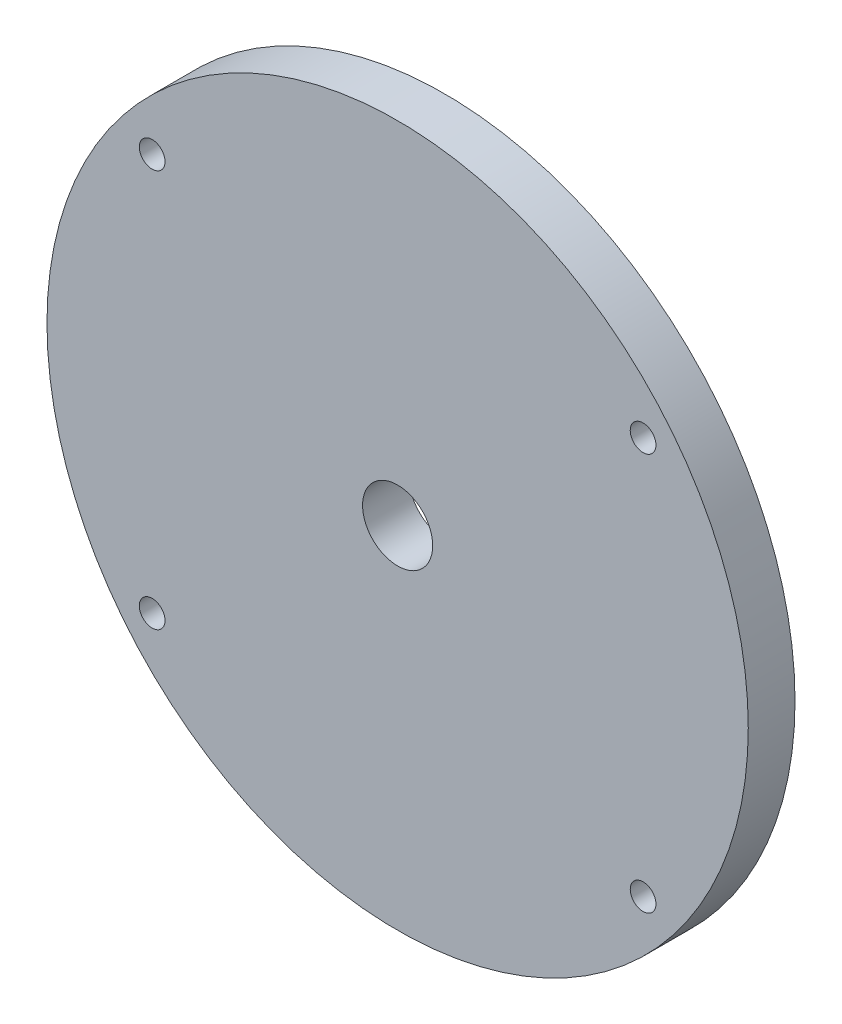
ISO-10303-21;
HEADER;
FILE_DESCRIPTION(('STEP AP214'),'2;1');
FILE_NAME('part.step','',(''),(''),'','','');
FILE_SCHEMA(('AUTOMOTIVE_DESIGN { 1 0 10303 214 1 1 1 1 }'));
ENDSEC;
DATA;
#1=APPLICATION_CONTEXT('core data for automotive mechanical design processes');
#2=APPLICATION_PROTOCOL_DEFINITION('international standard','automotive_design',2000,#1);
#3=PRODUCT_CONTEXT('',#1,'mechanical');
#4=PRODUCT('Part','Part','',(#3));
#5=PRODUCT_RELATED_PRODUCT_CATEGORY('part','',(#4));
#6=PRODUCT_DEFINITION_FORMATION('','',#4);
#7=PRODUCT_DEFINITION_CONTEXT('part definition',#1,'design');
#8=PRODUCT_DEFINITION('design','',#6,#7);
#9=PRODUCT_DEFINITION_SHAPE('','',#8);
#10=(LENGTH_UNIT() NAMED_UNIT(*) SI_UNIT(.MILLI.,.METRE.));
#11=(NAMED_UNIT(*) PLANE_ANGLE_UNIT() SI_UNIT($,.RADIAN.));
#12=(NAMED_UNIT(*) SI_UNIT($,.STERADIAN.) SOLID_ANGLE_UNIT());
#13=UNCERTAINTY_MEASURE_WITH_UNIT(LENGTH_MEASURE(1.E-05),#10,'distance_accuracy_value','');
#14=(GEOMETRIC_REPRESENTATION_CONTEXT(3) GLOBAL_UNCERTAINTY_ASSIGNED_CONTEXT((#13)) GLOBAL_UNIT_ASSIGNED_CONTEXT((#10,
#11,#12)) REPRESENTATION_CONTEXT('',''));
#15=CARTESIAN_POINT('',(0.,0.,0.));
#16=DIRECTION('',(0.,0.,1.));
#17=DIRECTION('',(1.,0.,0.));
#18=AXIS2_PLACEMENT_3D('',#15,#16,#17);
#19=CARTESIAN_POINT('',(0.,0.,0.));
#20=DIRECTION('',(0.,0.,1.));
#21=DIRECTION('',(1.,0.,0.));
#22=AXIS2_PLACEMENT_3D('',#19,#20,#21);
#23=PLANE('',#22);
#24=CARTESIAN_POINT('',(-52.5,-42.5,0.));
#25=DIRECTION('',(0.,0.,-1.));
#26=DIRECTION('',(-1.,0.,0.));
#27=AXIS2_PLACEMENT_3D('',#24,#25,#26);
#28=CIRCLE('',#27,5.2);
#29=CARTESIAN_POINT('',(-57.7,-42.5,0.));
#30=VERTEX_POINT('',#29);
#31=EDGE_CURVE('E94',#30,#30,#28,.T.);
#32=ORIENTED_EDGE('',*,*,#31,.F.);
#33=EDGE_LOOP('',(#32));
#34=FACE_BOUND('',#33,.T.);
#35=CARTESIAN_POINT('',(52.5,-42.5,0.));
#36=DIRECTION('',(0.,0.,-1.));
#37=DIRECTION('',(-1.,0.,0.));
#38=AXIS2_PLACEMENT_3D('',#35,#36,#37);
#39=CIRCLE('',#38,5.2);
#40=CARTESIAN_POINT('',(47.3,-42.5,0.));
#41=VERTEX_POINT('',#40);
#42=EDGE_CURVE('E85',#41,#41,#39,.T.);
#43=ORIENTED_EDGE('',*,*,#42,.F.);
#44=EDGE_LOOP('',(#43));
#45=FACE_BOUND('',#44,.T.);
#46=CARTESIAN_POINT('',(0.,0.,0.));
#47=DIRECTION('',(0.,0.,1.));
#48=DIRECTION('',(1.,0.,0.));
#49=AXIS2_PLACEMENT_3D('',#46,#47,#48);
#50=CIRCLE('',#49,7.5);
#51=CARTESIAN_POINT('',(7.5,0.,0.));
#52=VERTEX_POINT('',#51);
#53=EDGE_CURVE('E56',#52,#52,#50,.T.);
#54=ORIENTED_EDGE('',*,*,#53,.T.);
#55=EDGE_LOOP('',(#54));
#56=FACE_BOUND('',#55,.T.);
#57=CARTESIAN_POINT('',(0.,0.,0.));
#58=DIRECTION('',(0.,0.,1.));
#59=DIRECTION('',(1.,0.,0.));
#60=AXIS2_PLACEMENT_3D('',#57,#58,#59);
#61=CIRCLE('',#60,75.);
#62=CARTESIAN_POINT('',(75.,0.,0.));
#63=VERTEX_POINT('',#62);
#64=EDGE_CURVE('E47',#63,#63,#61,.T.);
#65=ORIENTED_EDGE('',*,*,#64,.F.);
#66=EDGE_LOOP('',(#65));
#67=FACE_BOUND('',#66,.T.);
#68=CARTESIAN_POINT('',(-52.5,42.5,0.));
#69=DIRECTION('',(0.,0.,-1.));
#70=DIRECTION('',(-1.,0.,0.));
#71=AXIS2_PLACEMENT_3D('',#68,#69,#70);
#72=CIRCLE('',#71,5.2);
#73=CARTESIAN_POINT('',(-57.7,42.5,0.));
#74=VERTEX_POINT('',#73);
#75=EDGE_CURVE('E67',#74,#74,#72,.T.);
#76=ORIENTED_EDGE('',*,*,#75,.F.);
#77=EDGE_LOOP('',(#76));
#78=FACE_BOUND('',#77,.T.);
#79=CARTESIAN_POINT('',(52.5,42.5,0.));
#80=DIRECTION('',(0.,0.,-1.));
#81=DIRECTION('',(-1.,0.,0.));
#82=AXIS2_PLACEMENT_3D('',#79,#80,#81);
#83=CIRCLE('',#82,5.2);
#84=CARTESIAN_POINT('',(47.3,42.5,0.));
#85=VERTEX_POINT('',#84);
#86=EDGE_CURVE('E76',#85,#85,#83,.T.);
#87=ORIENTED_EDGE('',*,*,#86,.F.);
#88=EDGE_LOOP('',(#87));
#89=FACE_BOUND('',#88,.T.);
#90=ADVANCED_FACE('F43',(#34,#45,#56,#67,#78,#89),#23,.F.);
#91=CARTESIAN_POINT('',(0.,0.,10.));
#92=DIRECTION('',(0.,0.,1.));
#93=DIRECTION('',(1.,0.,0.));
#94=AXIS2_PLACEMENT_3D('',#91,#92,#93);
#95=PLANE('',#94);
#96=CARTESIAN_POINT('',(-52.5,-42.5,10.));
#97=DIRECTION('',(0.,0.,-1.));
#98=DIRECTION('',(-1.,0.,0.));
#99=AXIS2_PLACEMENT_3D('',#96,#97,#98);
#100=CIRCLE('',#99,2.75);
#101=CARTESIAN_POINT('',(-55.25,-42.5,10.));
#102=VERTEX_POINT('',#101);
#103=EDGE_CURVE('E88',#102,#102,#100,.T.);
#104=ORIENTED_EDGE('',*,*,#103,.T.);
#105=EDGE_LOOP('',(#104));
#106=FACE_BOUND('',#105,.T.);
#107=CARTESIAN_POINT('',(52.5,-42.5,10.));
#108=DIRECTION('',(0.,0.,-1.));
#109=DIRECTION('',(-1.,0.,0.));
#110=AXIS2_PLACEMENT_3D('',#107,#108,#109);
#111=CIRCLE('',#110,2.75);
#112=CARTESIAN_POINT('',(49.75,-42.5,10.));
#113=VERTEX_POINT('',#112);
#114=EDGE_CURVE('E79',#113,#113,#111,.T.);
#115=ORIENTED_EDGE('',*,*,#114,.T.);
#116=EDGE_LOOP('',(#115));
#117=FACE_BOUND('',#116,.T.);
#118=CARTESIAN_POINT('',(52.5,42.5,10.));
#119=DIRECTION('',(0.,0.,-1.));
#120=DIRECTION('',(-1.,0.,0.));
#121=AXIS2_PLACEMENT_3D('',#118,#119,#120);
#122=CIRCLE('',#121,2.75);
#123=CARTESIAN_POINT('',(49.75,42.5,10.));
#124=VERTEX_POINT('',#123);
#125=EDGE_CURVE('E70',#124,#124,#122,.T.);
#126=ORIENTED_EDGE('',*,*,#125,.T.);
#127=EDGE_LOOP('',(#126));
#128=FACE_BOUND('',#127,.T.);
#129=CARTESIAN_POINT('',(-52.5,42.5,10.));
#130=DIRECTION('',(0.,0.,-1.));
#131=DIRECTION('',(-1.,0.,0.));
#132=AXIS2_PLACEMENT_3D('',#129,#130,#131);
#133=CIRCLE('',#132,2.75);
#134=CARTESIAN_POINT('',(-55.25,42.5,10.));
#135=VERTEX_POINT('',#134);
#136=EDGE_CURVE('E59',#135,#135,#133,.T.);
#137=ORIENTED_EDGE('',*,*,#136,.T.);
#138=EDGE_LOOP('',(#137));
#139=FACE_BOUND('',#138,.T.);
#140=CARTESIAN_POINT('',(0.,0.,10.));
#141=DIRECTION('',(0.,0.,1.));
#142=DIRECTION('',(1.,0.,0.));
#143=AXIS2_PLACEMENT_3D('',#140,#141,#142);
#144=CIRCLE('',#143,75.);
#145=CARTESIAN_POINT('',(75.,0.,10.));
#146=VERTEX_POINT('',#145);
#147=EDGE_CURVE('E10',#146,#146,#144,.T.);
#148=ORIENTED_EDGE('',*,*,#147,.T.);
#149=EDGE_LOOP('',(#148));
#150=FACE_BOUND('',#149,.T.);
#151=CARTESIAN_POINT('',(0.,0.,10.));
#152=DIRECTION('',(0.,0.,1.));
#153=DIRECTION('',(1.,0.,0.));
#154=AXIS2_PLACEMENT_3D('',#151,#152,#153);
#155=CIRCLE('',#154,7.5);
#156=CARTESIAN_POINT('',(7.5,0.,10.));
#157=VERTEX_POINT('',#156);
#158=EDGE_CURVE('E54',#157,#157,#155,.T.);
#159=ORIENTED_EDGE('',*,*,#158,.F.);
#160=EDGE_LOOP('',(#159));
#161=FACE_BOUND('',#160,.T.);
#162=ADVANCED_FACE('F102',(#106,#117,#128,#139,#150,#161),#95,.T.);
#163=CARTESIAN_POINT('',(0.,0.,10.));
#164=DIRECTION('',(0.,0.,-1.));
#165=DIRECTION('',(-1.,0.,0.));
#166=AXIS2_PLACEMENT_3D('',#163,#164,#165);
#167=CYLINDRICAL_SURFACE('',#166,75.);
#168=ORIENTED_EDGE('',*,*,#147,.F.);
#169=EDGE_LOOP('',(#168));
#170=FACE_BOUND('',#169,.T.);
#171=ORIENTED_EDGE('',*,*,#64,.T.);
#172=EDGE_LOOP('',(#171));
#173=FACE_BOUND('',#172,.T.);
#174=ADVANCED_FACE('F45',(#170,#173),#167,.T.);
#175=CARTESIAN_POINT('',(0.,0.,10.));
#176=DIRECTION('',(0.,0.,-1.));
#177=DIRECTION('',(-1.,0.,0.));
#178=AXIS2_PLACEMENT_3D('',#175,#176,#177);
#179=CYLINDRICAL_SURFACE('',#178,7.5);
#180=ORIENTED_EDGE('',*,*,#158,.T.);
#181=EDGE_LOOP('',(#180));
#182=FACE_BOUND('',#181,.T.);
#183=ORIENTED_EDGE('',*,*,#53,.F.);
#184=EDGE_LOOP('',(#183));
#185=FACE_BOUND('',#184,.T.);
#186=ADVANCED_FACE('F138',(#182,#185),#179,.F.);
#187=CARTESIAN_POINT('',(-52.5,42.5,0.));
#188=DIRECTION('',(0.,0.,-1.));
#189=DIRECTION('',(-1.,0.,0.));
#190=AXIS2_PLACEMENT_3D('',#187,#188,#189);
#191=CYLINDRICAL_SURFACE('',#190,2.74999999999999);
#192=ORIENTED_EDGE('',*,*,#136,.F.);
#193=EDGE_LOOP('',(#192));
#194=FACE_BOUND('',#193,.T.);
#195=CARTESIAN_POINT('',(-52.5,42.5,2.45000000000001));
#196=DIRECTION('',(0.,0.,-1.));
#197=DIRECTION('',(-1.,0.,0.));
#198=AXIS2_PLACEMENT_3D('',#195,#196,#197);
#199=CIRCLE('',#198,2.74999999999999);
#200=CARTESIAN_POINT('',(-55.25,42.5,2.45000000000001));
#201=VERTEX_POINT('',#200);
#202=EDGE_CURVE('E64',#201,#201,#199,.T.);
#203=ORIENTED_EDGE('',*,*,#202,.T.);
#204=EDGE_LOOP('',(#203));
#205=FACE_BOUND('',#204,.T.);
#206=ADVANCED_FACE('F134',(#194,#205),#191,.F.);
#207=CARTESIAN_POINT('',(-52.5,42.5,0.));
#208=DIRECTION('',(0.,0.,-1.));
#209=DIRECTION('',(-1.,0.,0.));
#210=AXIS2_PLACEMENT_3D('',#207,#208,#209);
#211=CONICAL_SURFACE('',#210,5.2,0.785398163397449);
#212=ORIENTED_EDGE('',*,*,#202,.F.);
#213=EDGE_LOOP('',(#212));
#214=FACE_BOUND('',#213,.T.);
#215=ORIENTED_EDGE('',*,*,#75,.T.);
#216=EDGE_LOOP('',(#215));
#217=FACE_BOUND('',#216,.T.);
#218=ADVANCED_FACE('F126',(#214,#217),#211,.F.);
#219=CARTESIAN_POINT('',(52.5,42.5,0.));
#220=DIRECTION('',(0.,0.,-1.));
#221=DIRECTION('',(-1.,0.,0.));
#222=AXIS2_PLACEMENT_3D('',#219,#220,#221);
#223=CYLINDRICAL_SURFACE('',#222,2.74999999999999);
#224=ORIENTED_EDGE('',*,*,#125,.F.);
#225=EDGE_LOOP('',(#224));
#226=FACE_BOUND('',#225,.T.);
#227=CARTESIAN_POINT('',(52.5,42.5,2.45000000000001));
#228=DIRECTION('',(0.,0.,-1.));
#229=DIRECTION('',(-1.,0.,0.));
#230=AXIS2_PLACEMENT_3D('',#227,#228,#229);
#231=CIRCLE('',#230,2.74999999999999);
#232=CARTESIAN_POINT('',(49.75,42.5,2.45000000000001));
#233=VERTEX_POINT('',#232);
#234=EDGE_CURVE('E73',#233,#233,#231,.T.);
#235=ORIENTED_EDGE('',*,*,#234,.T.);
#236=EDGE_LOOP('',(#235));
#237=FACE_BOUND('',#236,.T.);
#238=ADVANCED_FACE('F116',(#226,#237),#223,.F.);
#239=CARTESIAN_POINT('',(52.5,42.5,0.));
#240=DIRECTION('',(0.,0.,-1.));
#241=DIRECTION('',(-1.,0.,0.));
#242=AXIS2_PLACEMENT_3D('',#239,#240,#241);
#243=CONICAL_SURFACE('',#242,5.2,0.785398163397449);
#244=ORIENTED_EDGE('',*,*,#234,.F.);
#245=EDGE_LOOP('',(#244));
#246=FACE_BOUND('',#245,.T.);
#247=ORIENTED_EDGE('',*,*,#86,.T.);
#248=EDGE_LOOP('',(#247));
#249=FACE_BOUND('',#248,.T.);
#250=ADVANCED_FACE('F113',(#246,#249),#243,.F.);
#251=CARTESIAN_POINT('',(52.5,-42.5,0.));
#252=DIRECTION('',(0.,0.,-1.));
#253=DIRECTION('',(-1.,0.,0.));
#254=AXIS2_PLACEMENT_3D('',#251,#252,#253);
#255=CYLINDRICAL_SURFACE('',#254,2.74999999999999);
#256=ORIENTED_EDGE('',*,*,#114,.F.);
#257=EDGE_LOOP('',(#256));
#258=FACE_BOUND('',#257,.T.);
#259=CARTESIAN_POINT('',(52.5,-42.5,2.45000000000001));
#260=DIRECTION('',(0.,0.,-1.));
#261=DIRECTION('',(-1.,0.,0.));
#262=AXIS2_PLACEMENT_3D('',#259,#260,#261);
#263=CIRCLE('',#262,2.74999999999999);
#264=CARTESIAN_POINT('',(49.75,-42.5,2.45000000000001));
#265=VERTEX_POINT('',#264);
#266=EDGE_CURVE('E82',#265,#265,#263,.T.);
#267=ORIENTED_EDGE('',*,*,#266,.T.);
#268=EDGE_LOOP('',(#267));
#269=FACE_BOUND('',#268,.T.);
#270=ADVANCED_FACE('F115',(#258,#269),#255,.F.);
#271=CARTESIAN_POINT('',(52.5,-42.5,0.));
#272=DIRECTION('',(0.,0.,-1.));
#273=DIRECTION('',(-1.,0.,0.));
#274=AXIS2_PLACEMENT_3D('',#271,#272,#273);
#275=CONICAL_SURFACE('',#274,5.2,0.785398163397449);
#276=ORIENTED_EDGE('',*,*,#266,.F.);
#277=EDGE_LOOP('',(#276));
#278=FACE_BOUND('',#277,.T.);
#279=ORIENTED_EDGE('',*,*,#42,.T.);
#280=EDGE_LOOP('',(#279));
#281=FACE_BOUND('',#280,.T.);
#282=ADVANCED_FACE('F123',(#278,#281),#275,.F.);
#283=CARTESIAN_POINT('',(-52.5,-42.5,0.));
#284=DIRECTION('',(0.,0.,-1.));
#285=DIRECTION('',(-1.,0.,0.));
#286=AXIS2_PLACEMENT_3D('',#283,#284,#285);
#287=CYLINDRICAL_SURFACE('',#286,2.74999999999999);
#288=ORIENTED_EDGE('',*,*,#103,.F.);
#289=EDGE_LOOP('',(#288));
#290=FACE_BOUND('',#289,.T.);
#291=CARTESIAN_POINT('',(-52.5,-42.5,2.45000000000001));
#292=DIRECTION('',(0.,0.,-1.));
#293=DIRECTION('',(-1.,0.,0.));
#294=AXIS2_PLACEMENT_3D('',#291,#292,#293);
#295=CIRCLE('',#294,2.74999999999999);
#296=CARTESIAN_POINT('',(-55.25,-42.5,2.45000000000001));
#297=VERTEX_POINT('',#296);
#298=EDGE_CURVE('E91',#297,#297,#295,.T.);
#299=ORIENTED_EDGE('',*,*,#298,.T.);
#300=EDGE_LOOP('',(#299));
#301=FACE_BOUND('',#300,.T.);
#302=ADVANCED_FACE('F168',(#290,#301),#287,.F.);
#303=CARTESIAN_POINT('',(-52.5,-42.5,0.));
#304=DIRECTION('',(0.,0.,-1.));
#305=DIRECTION('',(-1.,0.,0.));
#306=AXIS2_PLACEMENT_3D('',#303,#304,#305);
#307=CONICAL_SURFACE('',#306,5.2,0.785398163397449);
#308=ORIENTED_EDGE('',*,*,#298,.F.);
#309=EDGE_LOOP('',(#308));
#310=FACE_BOUND('',#309,.T.);
#311=ORIENTED_EDGE('',*,*,#31,.T.);
#312=EDGE_LOOP('',(#311));
#313=FACE_BOUND('',#312,.T.);
#314=ADVANCED_FACE('F98',(#310,#313),#307,.F.);
#315=CLOSED_SHELL('',(#90,#162,#174,#186,#206,#218,#238,#250,#270,#282,#302,#314));
#316=MANIFOLD_SOLID_BREP('B2',#315);
#317=ADVANCED_BREP_SHAPE_REPRESENTATION('',(#18,#316),#14);
#318=SHAPE_DEFINITION_REPRESENTATION(#9,#317);
ENDSEC;
END-ISO-10303-21;
